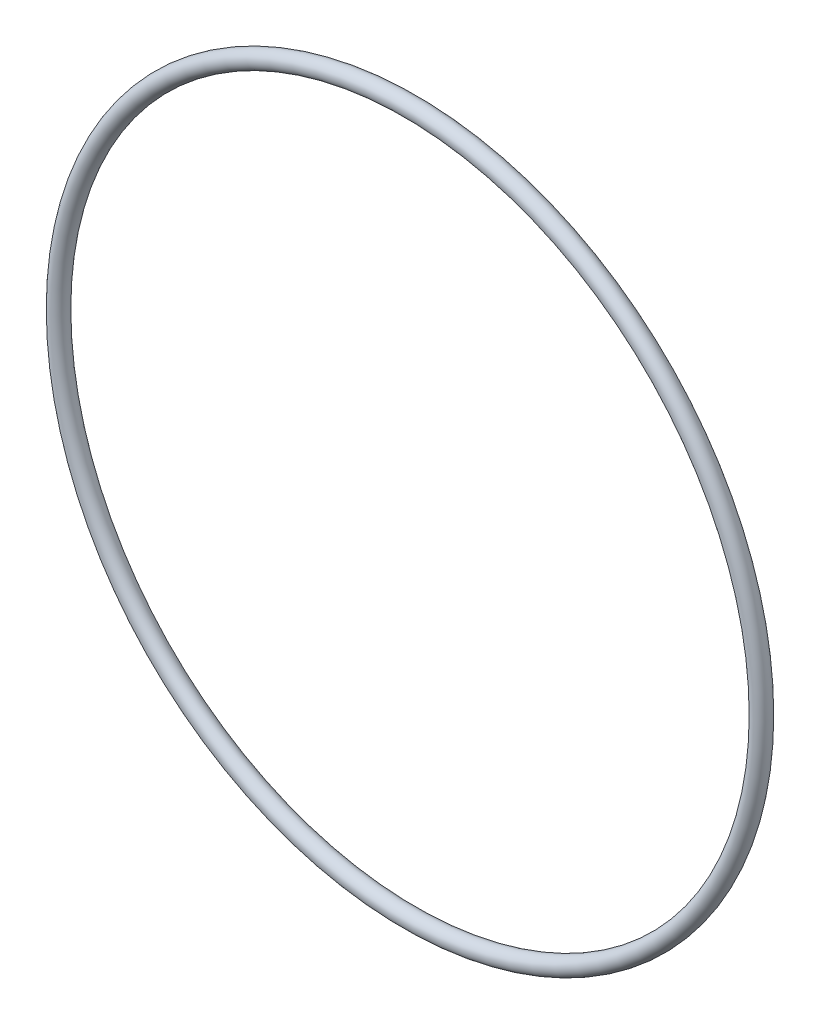
ISO-10303-21;
HEADER;
FILE_DESCRIPTION(('STEP AP214'),'2;1');
FILE_NAME('part.step','',(''),(''),'','','');
FILE_SCHEMA(('AUTOMOTIVE_DESIGN { 1 0 10303 214 1 1 1 1 }'));
ENDSEC;
DATA;
#1=APPLICATION_CONTEXT('core data for automotive mechanical design processes');
#2=APPLICATION_PROTOCOL_DEFINITION('international standard','automotive_design',2000,#1);
#3=PRODUCT_CONTEXT('',#1,'mechanical');
#4=PRODUCT('Part','Part','',(#3));
#5=PRODUCT_RELATED_PRODUCT_CATEGORY('part','',(#4));
#6=PRODUCT_DEFINITION_FORMATION('','',#4);
#7=PRODUCT_DEFINITION_CONTEXT('part definition',#1,'design');
#8=PRODUCT_DEFINITION('design','',#6,#7);
#9=PRODUCT_DEFINITION_SHAPE('','',#8);
#10=(LENGTH_UNIT() NAMED_UNIT(*) SI_UNIT(.MILLI.,.METRE.));
#11=(NAMED_UNIT(*) PLANE_ANGLE_UNIT() SI_UNIT($,.RADIAN.));
#12=(NAMED_UNIT(*) SI_UNIT($,.STERADIAN.) SOLID_ANGLE_UNIT());
#13=UNCERTAINTY_MEASURE_WITH_UNIT(LENGTH_MEASURE(1.E-05),#10,'distance_accuracy_value','');
#14=(GEOMETRIC_REPRESENTATION_CONTEXT(3) GLOBAL_UNCERTAINTY_ASSIGNED_CONTEXT((#13)) GLOBAL_UNIT_ASSIGNED_CONTEXT((#10,
#11,#12)) REPRESENTATION_CONTEXT('',''));
#15=CARTESIAN_POINT('',(0.,0.,0.));
#16=DIRECTION('',(0.,0.,1.));
#17=DIRECTION('',(1.,0.,0.));
#18=AXIS2_PLACEMENT_3D('',#15,#16,#17);
#19=CARTESIAN_POINT('',(0.,0.,0.));
#20=DIRECTION('',(0.,0.,1.));
#21=DIRECTION('',(1.,0.,0.));
#22=AXIS2_PLACEMENT_3D('',#19,#20,#21);
#23=TOROIDAL_SURFACE('',#22,71.4121,1.76529999999999);
#24=CARTESIAN_POINT('',(73.1774,0.,0.));
#25=VERTEX_POINT('',#24);
#26=VERTEX_LOOP('',#25);
#27=FACE_BOUND('',#26,.T.);
#28=ADVANCED_FACE('F37',(#27),#23,.T.);
#29=CLOSED_SHELL('',(#28));
#30=MANIFOLD_SOLID_BREP('B2',#29);
#31=ADVANCED_BREP_SHAPE_REPRESENTATION('',(#18,#30),#14);
#32=SHAPE_DEFINITION_REPRESENTATION(#9,#31);
ENDSEC;
END-ISO-10303-21;
